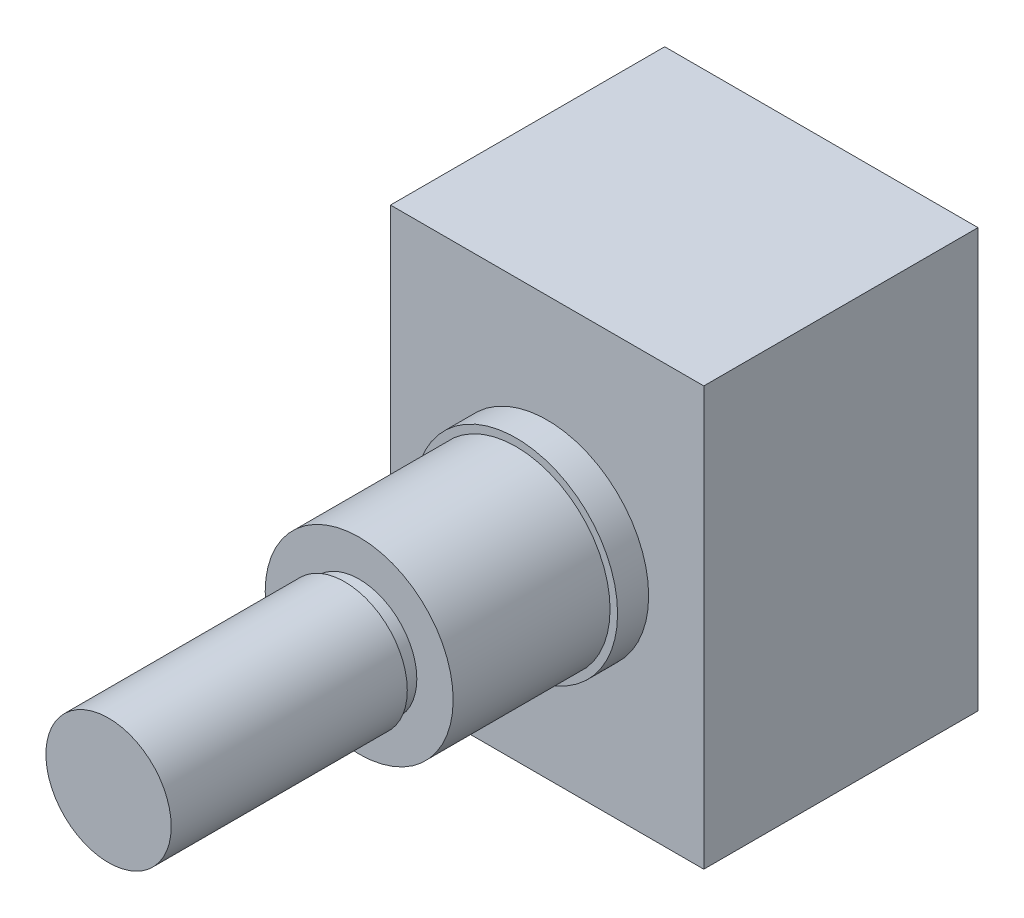
ISO-10303-21;
HEADER;
FILE_DESCRIPTION(('STEP AP214'),'2;1');
FILE_NAME('part.step','',(''),(''),'','','');
FILE_SCHEMA(('AUTOMOTIVE_DESIGN { 1 0 10303 214 1 1 1 1 }'));
ENDSEC;
DATA;
#1=APPLICATION_CONTEXT('core data for automotive mechanical design processes');
#2=APPLICATION_PROTOCOL_DEFINITION('international standard','automotive_design',2000,#1);
#3=PRODUCT_CONTEXT('',#1,'mechanical');
#4=PRODUCT('Part','Part','',(#3));
#5=PRODUCT_RELATED_PRODUCT_CATEGORY('part','',(#4));
#6=PRODUCT_DEFINITION_FORMATION('','',#4);
#7=PRODUCT_DEFINITION_CONTEXT('part definition',#1,'design');
#8=PRODUCT_DEFINITION('design','',#6,#7);
#9=PRODUCT_DEFINITION_SHAPE('','',#8);
#10=(LENGTH_UNIT() NAMED_UNIT(*) SI_UNIT(.MILLI.,.METRE.));
#11=(NAMED_UNIT(*) PLANE_ANGLE_UNIT() SI_UNIT($,.RADIAN.));
#12=(NAMED_UNIT(*) SI_UNIT($,.STERADIAN.) SOLID_ANGLE_UNIT());
#13=UNCERTAINTY_MEASURE_WITH_UNIT(LENGTH_MEASURE(1.E-05),#10,'distance_accuracy_value','');
#14=(GEOMETRIC_REPRESENTATION_CONTEXT(3) GLOBAL_UNCERTAINTY_ASSIGNED_CONTEXT((#13)) GLOBAL_UNIT_ASSIGNED_CONTEXT((#10,
#11,#12)) REPRESENTATION_CONTEXT('',''));
#15=CARTESIAN_POINT('',(0.,0.,0.));
#16=DIRECTION('',(0.,0.,1.));
#17=DIRECTION('',(1.,0.,0.));
#18=AXIS2_PLACEMENT_3D('',#15,#16,#17);
#19=CARTESIAN_POINT('',(0.,0.,23.4188));
#20=DIRECTION('',(0.,0.,1.));
#21=DIRECTION('',(1.,0.,0.));
#22=AXIS2_PLACEMENT_3D('',#19,#20,#21);
#23=PLANE('',#22);
#24=CARTESIAN_POINT('',(0.,0.,23.4188));
#25=DIRECTION('',(0.,0.,1.));
#26=DIRECTION('',(1.,0.,0.));
#27=AXIS2_PLACEMENT_3D('',#24,#25,#26);
#28=CIRCLE('',#27,4.7625);
#29=CARTESIAN_POINT('',(-4.7625,0.,23.4188));
#30=VERTEX_POINT('',#29);
#31=EDGE_CURVE('E259',#30,#30,#28,.T.);
#32=ORIENTED_EDGE('',*,*,#31,.T.);
#33=EDGE_LOOP('',(#32));
#34=FACE_BOUND('',#33,.T.);
#35=CARTESIAN_POINT('',(0.,0.,23.4188));
#36=DIRECTION('',(0.,0.,1.));
#37=DIRECTION('',(1.,0.,0.));
#38=AXIS2_PLACEMENT_3D('',#35,#36,#37);
#39=CIRCLE('',#38,2.921);
#40=CARTESIAN_POINT('',(2.921,0.,23.4188));
#41=VERTEX_POINT('',#40);
#42=EDGE_CURVE('E277',#41,#41,#39,.T.);
#43=ORIENTED_EDGE('',*,*,#42,.F.);
#44=EDGE_LOOP('',(#43));
#45=FACE_BOUND('',#44,.T.);
#46=ADVANCED_FACE('F34',(#34,#45),#23,.T.);
#47=CARTESIAN_POINT('',(0.,0.,15.4686));
#48=DIRECTION('',(0.,0.,1.));
#49=DIRECTION('',(1.,0.,0.));
#50=AXIS2_PLACEMENT_3D('',#47,#48,#49);
#51=PLANE('',#50);
#52=CARTESIAN_POINT('',(0.,0.,15.4686));
#53=DIRECTION('',(0.,0.,1.));
#54=DIRECTION('',(1.,0.,0.));
#55=AXIS2_PLACEMENT_3D('',#52,#53,#54);
#56=CIRCLE('',#55,5.1435);
#57=CARTESIAN_POINT('',(5.1435,0.,15.4686));
#58=VERTEX_POINT('',#57);
#59=EDGE_CURVE('E106',#58,#58,#56,.T.);
#60=ORIENTED_EDGE('',*,*,#59,.T.);
#61=EDGE_LOOP('',(#60));
#62=FACE_BOUND('',#61,.T.);
#63=CARTESIAN_POINT('',(0.,0.,15.4686));
#64=DIRECTION('',(0.,0.,1.));
#65=DIRECTION('',(1.,0.,0.));
#66=AXIS2_PLACEMENT_3D('',#63,#64,#65);
#67=CIRCLE('',#66,4.7625);
#68=CARTESIAN_POINT('',(-4.7625,0.,15.4686));
#69=VERTEX_POINT('',#68);
#70=EDGE_CURVE('E38',#69,#69,#67,.F.);
#71=ORIENTED_EDGE('',*,*,#70,.T.);
#72=EDGE_LOOP('',(#71));
#73=FACE_BOUND('',#72,.T.);
#74=ADVANCED_FACE('F130',(#62,#73),#51,.T.);
#75=CARTESIAN_POINT('',(0.,0.,13.8938));
#76=DIRECTION('',(0.,0.,-1.));
#77=DIRECTION('',(-1.,0.,0.));
#78=AXIS2_PLACEMENT_3D('',#75,#76,#77);
#79=PLANE('',#78);
#80=DIRECTION('',(0.,1.,0.));
#81=VECTOR('',#80,1.);
#82=CARTESIAN_POINT('',(7.9375,-10.6045,13.8938));
#83=LINE('',#82,#81);
#84=CARTESIAN_POINT('',(7.9375,-10.6045,13.8938));
#85=VERTEX_POINT('',#84);
#86=CARTESIAN_POINT('',(7.9375,10.6045,13.8938));
#87=VERTEX_POINT('',#86);
#88=EDGE_CURVE('E89',#85,#87,#83,.T.);
#89=ORIENTED_EDGE('',*,*,#88,.T.);
#90=DIRECTION('',(-1.,0.,0.));
#91=VECTOR('',#90,1.);
#92=CARTESIAN_POINT('',(-7.9375,10.6045,13.8938));
#93=LINE('',#92,#91);
#94=CARTESIAN_POINT('',(-7.9375,10.6045,13.8938));
#95=VERTEX_POINT('',#94);
#96=EDGE_CURVE('E83',#87,#95,#93,.T.);
#97=ORIENTED_EDGE('',*,*,#96,.T.);
#98=DIRECTION('',(0.,-1.,0.));
#99=VECTOR('',#98,1.);
#100=CARTESIAN_POINT('',(-7.9375,-10.6045,13.8938));
#101=LINE('',#100,#99);
#102=CARTESIAN_POINT('',(-7.9375,-10.6045,13.8938));
#103=VERTEX_POINT('',#102);
#104=EDGE_CURVE('E87',#95,#103,#101,.T.);
#105=ORIENTED_EDGE('',*,*,#104,.T.);
#106=DIRECTION('',(1.,0.,0.));
#107=VECTOR('',#106,1.);
#108=CARTESIAN_POINT('',(-7.9375,-10.6045,13.8938));
#109=LINE('',#108,#107);
#110=EDGE_CURVE('E52',#103,#85,#109,.T.);
#111=ORIENTED_EDGE('',*,*,#110,.T.);
#112=EDGE_LOOP('',(#89,#97,#105,#111));
#113=FACE_BOUND('',#112,.T.);
#114=CARTESIAN_POINT('',(0.,0.,13.8938));
#115=DIRECTION('',(0.,0.,-1.));
#116=DIRECTION('',(-1.,0.,0.));
#117=AXIS2_PLACEMENT_3D('',#114,#115,#116);
#118=CIRCLE('',#117,5.1435);
#119=CARTESIAN_POINT('',(-5.1435,0.,13.8938));
#120=VERTEX_POINT('',#119);
#121=EDGE_CURVE('E11',#120,#120,#118,.F.);
#122=ORIENTED_EDGE('',*,*,#121,.F.);
#123=EDGE_LOOP('',(#122));
#124=FACE_BOUND('',#123,.T.);
#125=ADVANCED_FACE('F84',(#113,#124),#79,.F.);
#126=CARTESIAN_POINT('',(7.9375,-10.6045,13.8938));
#127=DIRECTION('',(-1.,0.,0.));
#128=DIRECTION('',(0.,0.,1.));
#129=AXIS2_PLACEMENT_3D('',#126,#127,#128);
#130=PLANE('',#129);
#131=DIRECTION('',(0.,1.,0.));
#132=VECTOR('',#131,1.);
#133=CARTESIAN_POINT('',(7.9375,-10.6045,0.));
#134=LINE('',#133,#132);
#135=CARTESIAN_POINT('',(7.9375,-10.6045,0.));
#136=VERTEX_POINT('',#135);
#137=CARTESIAN_POINT('',(7.9375,10.6045,0.));
#138=VERTEX_POINT('',#137);
#139=EDGE_CURVE('E103',#136,#138,#134,.T.);
#140=ORIENTED_EDGE('',*,*,#139,.T.);
#141=DIRECTION('',(0.,0.,-1.));
#142=VECTOR('',#141,1.);
#143=CARTESIAN_POINT('',(7.9375,10.6045,13.8938));
#144=LINE('',#143,#142);
#145=EDGE_CURVE('E44',#87,#138,#144,.T.);
#146=ORIENTED_EDGE('',*,*,#145,.F.);
#147=ORIENTED_EDGE('',*,*,#88,.F.);
#148=DIRECTION('',(0.,0.,-1.));
#149=VECTOR('',#148,1.);
#150=CARTESIAN_POINT('',(7.9375,-10.6045,13.8938));
#151=LINE('',#150,#149);
#152=EDGE_CURVE('E99',#85,#136,#151,.T.);
#153=ORIENTED_EDGE('',*,*,#152,.T.);
#154=EDGE_LOOP('',(#140,#146,#147,#153));
#155=FACE_BOUND('',#154,.T.);
#156=ADVANCED_FACE('F36',(#155),#130,.F.);
#157=CARTESIAN_POINT('',(-7.9375,10.6045,13.8938));
#158=DIRECTION('',(0.,-1.,0.));
#159=DIRECTION('',(0.,0.,-1.));
#160=AXIS2_PLACEMENT_3D('',#157,#158,#159);
#161=PLANE('',#160);
#162=DIRECTION('',(-1.,0.,0.));
#163=VECTOR('',#162,1.);
#164=CARTESIAN_POINT('',(-7.9375,10.6045,0.));
#165=LINE('',#164,#163);
#166=CARTESIAN_POINT('',(-7.9375,10.6045,0.));
#167=VERTEX_POINT('',#166);
#168=EDGE_CURVE('E94',#138,#167,#165,.T.);
#169=ORIENTED_EDGE('',*,*,#168,.T.);
#170=DIRECTION('',(0.,0.,-1.));
#171=VECTOR('',#170,1.);
#172=CARTESIAN_POINT('',(-7.9375,10.6045,13.8938));
#173=LINE('',#172,#171);
#174=EDGE_CURVE('E92',#95,#167,#173,.T.);
#175=ORIENTED_EDGE('',*,*,#174,.F.);
#176=ORIENTED_EDGE('',*,*,#96,.F.);
#177=ORIENTED_EDGE('',*,*,#145,.T.);
#178=EDGE_LOOP('',(#169,#175,#176,#177));
#179=FACE_BOUND('',#178,.T.);
#180=ADVANCED_FACE('F93',(#179),#161,.F.);
#181=CARTESIAN_POINT('',(-7.9375,-10.6045,13.8938));
#182=DIRECTION('',(1.,0.,0.));
#183=DIRECTION('',(0.,0.,-1.));
#184=AXIS2_PLACEMENT_3D('',#181,#182,#183);
#185=PLANE('',#184);
#186=DIRECTION('',(0.,-1.,0.));
#187=VECTOR('',#186,1.);
#188=CARTESIAN_POINT('',(-7.9375,-10.6045,0.));
#189=LINE('',#188,#187);
#190=CARTESIAN_POINT('',(-7.9375,-10.6045,0.));
#191=VERTEX_POINT('',#190);
#192=EDGE_CURVE('E69',#167,#191,#189,.T.);
#193=ORIENTED_EDGE('',*,*,#192,.T.);
#194=DIRECTION('',(0.,0.,-1.));
#195=VECTOR('',#194,1.);
#196=CARTESIAN_POINT('',(-7.9375,-10.6045,13.8938));
#197=LINE('',#196,#195);
#198=EDGE_CURVE('E95',#103,#191,#197,.T.);
#199=ORIENTED_EDGE('',*,*,#198,.F.);
#200=ORIENTED_EDGE('',*,*,#104,.F.);
#201=ORIENTED_EDGE('',*,*,#174,.T.);
#202=EDGE_LOOP('',(#193,#199,#200,#201));
#203=FACE_BOUND('',#202,.T.);
#204=ADVANCED_FACE('F97',(#203),#185,.F.);
#205=CARTESIAN_POINT('',(-7.9375,-10.6045,13.8938));
#206=DIRECTION('',(0.,1.,0.));
#207=DIRECTION('',(0.,0.,1.));
#208=AXIS2_PLACEMENT_3D('',#205,#206,#207);
#209=PLANE('',#208);
#210=DIRECTION('',(1.,0.,0.));
#211=VECTOR('',#210,1.);
#212=CARTESIAN_POINT('',(-7.9375,-10.6045,0.));
#213=LINE('',#212,#211);
#214=EDGE_CURVE('E75',#191,#136,#213,.T.);
#215=ORIENTED_EDGE('',*,*,#214,.T.);
#216=ORIENTED_EDGE('',*,*,#152,.F.);
#217=ORIENTED_EDGE('',*,*,#110,.F.);
#218=ORIENTED_EDGE('',*,*,#198,.T.);
#219=EDGE_LOOP('',(#215,#216,#217,#218));
#220=FACE_BOUND('',#219,.T.);
#221=ADVANCED_FACE('F118',(#220),#209,.F.);
#222=CARTESIAN_POINT('',(0.,0.,0.));
#223=DIRECTION('',(0.,0.,-1.));
#224=DIRECTION('',(-1.,0.,0.));
#225=AXIS2_PLACEMENT_3D('',#222,#223,#224);
#226=PLANE('',#225);
#227=ORIENTED_EDGE('',*,*,#139,.F.);
#228=ORIENTED_EDGE('',*,*,#214,.F.);
#229=ORIENTED_EDGE('',*,*,#192,.F.);
#230=ORIENTED_EDGE('',*,*,#168,.F.);
#231=EDGE_LOOP('',(#227,#228,#229,#230));
#232=FACE_BOUND('',#231,.T.);
#233=ADVANCED_FACE('F115',(#232),#226,.T.);
#234=CARTESIAN_POINT('',(0.,0.,15.4686));
#235=DIRECTION('',(0.,0.,-1.));
#236=DIRECTION('',(-1.,0.,0.));
#237=AXIS2_PLACEMENT_3D('',#234,#235,#236);
#238=CYLINDRICAL_SURFACE('',#237,5.1435);
#239=ORIENTED_EDGE('',*,*,#59,.F.);
#240=EDGE_LOOP('',(#239));
#241=FACE_BOUND('',#240,.T.);
#242=ORIENTED_EDGE('',*,*,#121,.T.);
#243=EDGE_LOOP('',(#242));
#244=FACE_BOUND('',#243,.T.);
#245=ADVANCED_FACE('F117',(#241,#244),#238,.T.);
#246=CARTESIAN_POINT('',(0.,0.,23.4188));
#247=DIRECTION('',(0.,0.,-1.));
#248=DIRECTION('',(-1.,0.,0.));
#249=AXIS2_PLACEMENT_3D('',#246,#247,#248);
#250=CYLINDRICAL_SURFACE('',#249,4.7625);
#251=CARTESIAN_POINT('',(-4.7625,0.,15.4686));
#252=CARTESIAN_POINT('',(-4.7625,0.,15.5514145833333));
#253=CARTESIAN_POINT('',(-4.7625,0.,15.6342291666667));
#254=CARTESIAN_POINT('',(-4.7625,0.,15.7998583333333));
#255=CARTESIAN_POINT('',(-4.7625,0.,15.8826729166667));
#256=CARTESIAN_POINT('',(-4.7625,0.,16.0483020833333));
#257=CARTESIAN_POINT('',(-4.7625,0.,16.1311166666667));
#258=CARTESIAN_POINT('',(-4.7625,0.,16.2967458333333));
#259=CARTESIAN_POINT('',(-4.7625,0.,16.3795604166667));
#260=CARTESIAN_POINT('',(-4.7625,0.,16.5451895833333));
#261=CARTESIAN_POINT('',(-4.7625,0.,16.6280041666667));
#262=CARTESIAN_POINT('',(-4.7625,0.,16.7936333333333));
#263=CARTESIAN_POINT('',(-4.7625,0.,16.8764479166667));
#264=CARTESIAN_POINT('',(-4.7625,0.,17.0420770833333));
#265=CARTESIAN_POINT('',(-4.7625,0.,17.1248916666667));
#266=CARTESIAN_POINT('',(-4.7625,0.,17.2905208333333));
#267=CARTESIAN_POINT('',(-4.7625,0.,17.3733354166667));
#268=CARTESIAN_POINT('',(-4.7625,0.,17.5389645833333));
#269=CARTESIAN_POINT('',(-4.7625,0.,17.6217791666667));
#270=CARTESIAN_POINT('',(-4.7625,0.,17.7874083333333));
#271=CARTESIAN_POINT('',(-4.7625,0.,17.8702229166667));
#272=CARTESIAN_POINT('',(-4.7625,0.,18.0358520833333));
#273=CARTESIAN_POINT('',(-4.7625,0.,18.1186666666667));
#274=CARTESIAN_POINT('',(-4.7625,0.,18.2842958333333));
#275=CARTESIAN_POINT('',(-4.7625,0.,18.3671104166667));
#276=CARTESIAN_POINT('',(-4.7625,0.,18.5327395833333));
#277=CARTESIAN_POINT('',(-4.7625,0.,18.6155541666667));
#278=CARTESIAN_POINT('',(-4.7625,0.,18.7811833333333));
#279=CARTESIAN_POINT('',(-4.7625,0.,18.8639979166667));
#280=CARTESIAN_POINT('',(-4.7625,0.,19.0296270833333));
#281=CARTESIAN_POINT('',(-4.7625,0.,19.1124416666667));
#282=CARTESIAN_POINT('',(-4.7625,0.,19.2780708333333));
#283=CARTESIAN_POINT('',(-4.7625,0.,19.3608854166667));
#284=CARTESIAN_POINT('',(-4.7625,0.,19.5265145833333));
#285=CARTESIAN_POINT('',(-4.7625,0.,19.6093291666667));
#286=CARTESIAN_POINT('',(-4.7625,0.,19.7749583333333));
#287=CARTESIAN_POINT('',(-4.7625,0.,19.8577729166667));
#288=CARTESIAN_POINT('',(-4.7625,0.,20.0234020833333));
#289=CARTESIAN_POINT('',(-4.7625,0.,20.1062166666667));
#290=CARTESIAN_POINT('',(-4.7625,0.,20.2718458333333));
#291=CARTESIAN_POINT('',(-4.7625,0.,20.3546604166667));
#292=CARTESIAN_POINT('',(-4.7625,0.,20.5202895833333));
#293=CARTESIAN_POINT('',(-4.7625,0.,20.6031041666667));
#294=CARTESIAN_POINT('',(-4.7625,0.,20.7687333333333));
#295=CARTESIAN_POINT('',(-4.7625,0.,20.8515479166667));
#296=CARTESIAN_POINT('',(-4.7625,0.,21.0171770833333));
#297=CARTESIAN_POINT('',(-4.7625,0.,21.0999916666667));
#298=CARTESIAN_POINT('',(-4.7625,0.,21.2656208333333));
#299=CARTESIAN_POINT('',(-4.7625,0.,21.3484354166667));
#300=CARTESIAN_POINT('',(-4.7625,0.,21.5140645833333));
#301=CARTESIAN_POINT('',(-4.7625,0.,21.5968791666667));
#302=CARTESIAN_POINT('',(-4.7625,0.,21.7625083333333));
#303=CARTESIAN_POINT('',(-4.7625,0.,21.8453229166667));
#304=CARTESIAN_POINT('',(-4.7625,0.,22.0109520833333));
#305=CARTESIAN_POINT('',(-4.7625,0.,22.0937666666667));
#306=CARTESIAN_POINT('',(-4.7625,0.,22.2593958333333));
#307=CARTESIAN_POINT('',(-4.7625,0.,22.3422104166667));
#308=CARTESIAN_POINT('',(-4.7625,0.,22.5078395833333));
#309=CARTESIAN_POINT('',(-4.7625,0.,22.5906541666667));
#310=CARTESIAN_POINT('',(-4.7625,0.,22.7562833333333));
#311=CARTESIAN_POINT('',(-4.7625,0.,22.8390979166667));
#312=CARTESIAN_POINT('',(-4.7625,0.,23.0047270833333));
#313=CARTESIAN_POINT('',(-4.7625,0.,23.0875416666667));
#314=CARTESIAN_POINT('',(-4.7625,0.,23.2531708333333));
#315=CARTESIAN_POINT('',(-4.7625,0.,23.3359854166667));
#316=CARTESIAN_POINT('',(-4.7625,0.,23.4188));
#317=B_SPLINE_CURVE_WITH_KNOTS('',3,(#251,#252,#253,#254,#255,#256,#257,#258,#259,#260,#261,
#262,#263,#264,#265,#266,#267,#268,#269,#270,#271,#272,#273,#274,#275,#276,#277,#278,#279,#280,
#281,#282,#283,#284,#285,#286,#287,#288,#289,#290,#291,#292,#293,#294,#295,#296,#297,#298,#299,
#300,#301,#302,#303,#304,#305,#306,#307,#308,#309,#310,#311,#312,#313,#314,#315,#316),
.UNSPECIFIED.,.F.,.F.,(4,2,2,2,2,2,2,2,2,2,2,2,2,2,2,2,2,2,2,2,2,2,2,2,2,2,2,2,2,2,2,2,4),(0.,
0.248443749999999,0.496887499999999,0.74533125,0.993775000000001,1.24221875,1.4906625,
1.73910625,1.98755,2.23599375,2.4844375,2.73288125,2.981325,3.22976875,3.4782125,3.72665625,
3.9751,4.22354375,4.4719875,4.72043125,4.968875,5.21731875,5.4657625,5.71420625,5.96265,
6.21109375,6.4595375,6.70798125,6.956425,7.20486875,7.4533125,7.70175625,7.9502),.UNSPECIFIED.);
#318=EDGE_CURVE('BSEAM124',#69,#30,#317,.T.);
#319=ORIENTED_EDGE('',*,*,#70,.F.);
#320=ORIENTED_EDGE('',*,*,#31,.F.);
#321=ORIENTED_EDGE('',*,*,#318,.T.);
#322=ORIENTED_EDGE('',*,*,#318,.F.);
#323=EDGE_LOOP('',(#319,#321,#320,#322));
#324=FACE_BOUND('',#323,.T.);
#325=ADVANCED_FACE('F124',(#324),#250,.T.);
#326=CARTESIAN_POINT('',(3.175,0.,24.1554));
#327=DIRECTION('',(0.,0.,1.));
#328=DIRECTION('',(1.,0.,0.));
#329=AXIS2_PLACEMENT_3D('',#326,#327,#328);
#330=PLANE('',#329);
#331=CARTESIAN_POINT('',(0.,0.,24.1554));
#332=DIRECTION('',(0.,0.,1.));
#333=DIRECTION('',(1.,0.,0.));
#334=AXIS2_PLACEMENT_3D('',#331,#332,#333);
#335=CIRCLE('',#334,3.175);
#336=CARTESIAN_POINT('',(3.175,0.,24.1554));
#337=VERTEX_POINT('',#336);
#338=EDGE_CURVE('E255',#337,#337,#335,.T.);
#339=ORIENTED_EDGE('',*,*,#338,.F.);
#340=EDGE_LOOP('',(#339));
#341=FACE_BOUND('',#340,.T.);
#342=CARTESIAN_POINT('',(0.,0.,24.1554));
#343=DIRECTION('',(0.,0.,1.));
#344=DIRECTION('',(1.,0.,0.));
#345=AXIS2_PLACEMENT_3D('',#342,#343,#344);
#346=CIRCLE('',#345,2.921);
#347=CARTESIAN_POINT('',(2.921,0.,24.1554));
#348=VERTEX_POINT('',#347);
#349=EDGE_CURVE('E262',#348,#348,#346,.T.);
#350=ORIENTED_EDGE('',*,*,#349,.T.);
#351=EDGE_LOOP('',(#350));
#352=FACE_BOUND('',#351,.T.);
#353=ADVANCED_FACE('F145',(#341,#352),#330,.F.);
#354=CARTESIAN_POINT('',(0.,0.,36.1188));
#355=DIRECTION('',(0.,0.,1.));
#356=DIRECTION('',(1.,0.,0.));
#357=AXIS2_PLACEMENT_3D('',#354,#355,#356);
#358=CYLINDRICAL_SURFACE('',#357,2.921);
#359=ORIENTED_EDGE('',*,*,#349,.F.);
#360=EDGE_LOOP('',(#359));
#361=FACE_BOUND('',#360,.T.);
#362=ORIENTED_EDGE('',*,*,#42,.T.);
#363=EDGE_LOOP('',(#362));
#364=FACE_BOUND('',#363,.T.);
#365=ADVANCED_FACE('F205',(#361,#364),#358,.T.);
#366=CARTESIAN_POINT('',(0.,0.,36.1188));
#367=DIRECTION('',(0.,0.,1.));
#368=DIRECTION('',(1.,0.,0.));
#369=AXIS2_PLACEMENT_3D('',#366,#367,#368);
#370=PLANE('',#369);
#371=CARTESIAN_POINT('',(0.,0.,36.1188));
#372=DIRECTION('',(0.,0.,1.));
#373=DIRECTION('',(1.,0.,0.));
#374=AXIS2_PLACEMENT_3D('',#371,#372,#373);
#375=CIRCLE('',#374,3.175);
#376=CARTESIAN_POINT('',(3.175,0.,36.1188));
#377=VERTEX_POINT('',#376);
#378=EDGE_CURVE('E258',#377,#377,#375,.T.);
#379=ORIENTED_EDGE('',*,*,#378,.T.);
#380=EDGE_LOOP('',(#379));
#381=FACE_BOUND('',#380,.T.);
#382=ADVANCED_FACE('F200',(#381),#370,.T.);
#383=CARTESIAN_POINT('',(0.,0.,36.1188));
#384=DIRECTION('',(0.,0.,-1.));
#385=DIRECTION('',(-1.,0.,0.));
#386=AXIS2_PLACEMENT_3D('',#383,#384,#385);
#387=CYLINDRICAL_SURFACE('',#386,3.175);
#388=ORIENTED_EDGE('',*,*,#338,.T.);
#389=EDGE_LOOP('',(#388));
#390=FACE_BOUND('',#389,.T.);
#391=ORIENTED_EDGE('',*,*,#378,.F.);
#392=EDGE_LOOP('',(#391));
#393=FACE_BOUND('',#392,.T.);
#394=ADVANCED_FACE('F142',(#390,#393),#387,.T.);
#395=CLOSED_SHELL('',(#46,#74,#125,#156,#180,#204,#221,#233,#245,#325,#353,#365,#382,#394));
#396=MANIFOLD_SOLID_BREP('B2',#395);
#397=ADVANCED_BREP_SHAPE_REPRESENTATION('',(#18,#396),#14);
#398=SHAPE_DEFINITION_REPRESENTATION(#9,#397);
ENDSEC;
END-ISO-10303-21;
